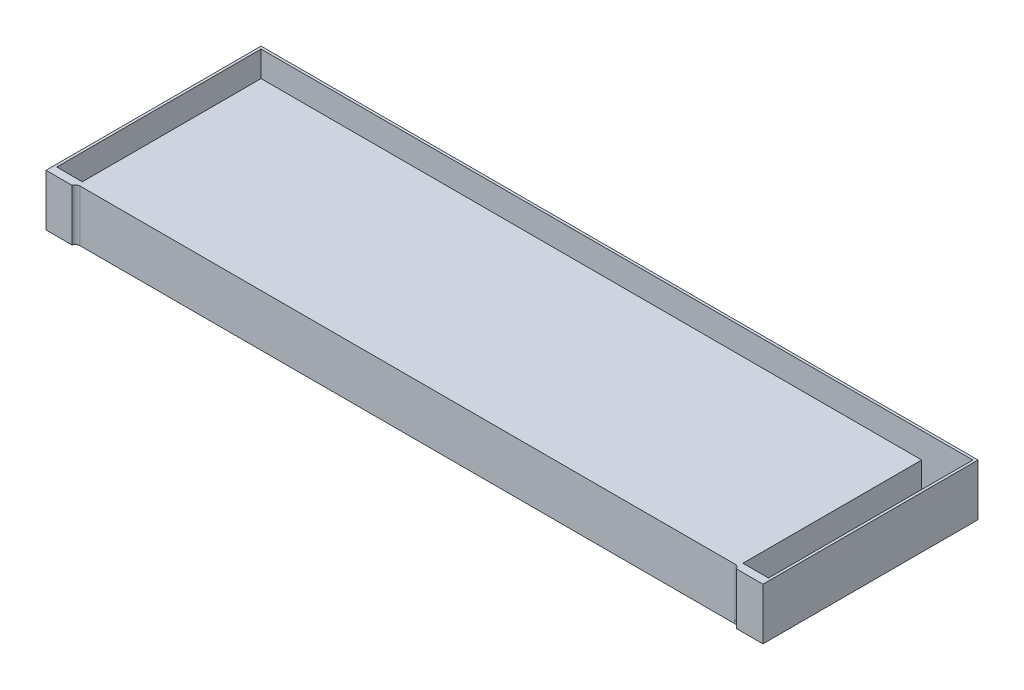
ISO-10303-21;
HEADER;
FILE_DESCRIPTION(('STEP AP214'),'2;1');
FILE_NAME('part.step','',(''),(''),'','','');
FILE_SCHEMA(('AUTOMOTIVE_DESIGN { 1 0 10303 214 1 1 1 1 }'));
ENDSEC;
DATA;
#1=APPLICATION_CONTEXT('core data for automotive mechanical design processes');
#2=APPLICATION_PROTOCOL_DEFINITION('international standard','automotive_design',2000,#1);
#3=PRODUCT_CONTEXT('',#1,'mechanical');
#4=PRODUCT('Part','Part','',(#3));
#5=PRODUCT_RELATED_PRODUCT_CATEGORY('part','',(#4));
#6=PRODUCT_DEFINITION_FORMATION('','',#4);
#7=PRODUCT_DEFINITION_CONTEXT('part definition',#1,'design');
#8=PRODUCT_DEFINITION('design','',#6,#7);
#9=PRODUCT_DEFINITION_SHAPE('','',#8);
#10=(LENGTH_UNIT() NAMED_UNIT(*) SI_UNIT(.MILLI.,.METRE.));
#11=(NAMED_UNIT(*) PLANE_ANGLE_UNIT() SI_UNIT($,.RADIAN.));
#12=(NAMED_UNIT(*) SI_UNIT($,.STERADIAN.) SOLID_ANGLE_UNIT());
#13=UNCERTAINTY_MEASURE_WITH_UNIT(LENGTH_MEASURE(1.E-05),#10,'distance_accuracy_value','');
#14=(GEOMETRIC_REPRESENTATION_CONTEXT(3) GLOBAL_UNCERTAINTY_ASSIGNED_CONTEXT((#13)) GLOBAL_UNIT_ASSIGNED_CONTEXT((#10,
#11,#12)) REPRESENTATION_CONTEXT('',''));
#15=CARTESIAN_POINT('',(0.,0.,0.));
#16=DIRECTION('',(0.,0.,1.));
#17=DIRECTION('',(1.,0.,0.));
#18=AXIS2_PLACEMENT_3D('',#15,#16,#17);
#19=CARTESIAN_POINT('',(170.399999999994,-68.1212867515913,-3.85));
#20=DIRECTION('',(1.,0.,0.));
#21=DIRECTION('',(0.,0.,-1.));
#22=AXIS2_PLACEMENT_3D('',#19,#20,#21);
#23=PLANE('',#22);
#24=DIRECTION('',(0.,0.,-1.));
#25=VECTOR('',#24,1.);
#26=CARTESIAN_POINT('',(170.399999999994,-66.101,-3.85));
#27=LINE('',#26,#25);
#28=CARTESIAN_POINT('',(170.399999999994,-66.101,3.13136582984871));
#29=VERTEX_POINT('',#28);
#30=CARTESIAN_POINT('',(170.399999999994,-66.101,-3.85));
#31=VERTEX_POINT('',#30);
#32=EDGE_CURVE('E322',#29,#31,#27,.T.);
#33=ORIENTED_EDGE('',*,*,#32,.F.);
#34=DIRECTION('',(0.,1.,0.));
#35=VECTOR('',#34,1.);
#36=CARTESIAN_POINT('',(170.399999999994,-68.1212867515913,3.13136582984871));
#37=LINE('',#36,#35);
#38=CARTESIAN_POINT('',(170.399999999994,-68.1212867515913,3.13136582984871));
#39=VERTEX_POINT('',#38);
#40=EDGE_CURVE('E37',#39,#29,#37,.T.);
#41=ORIENTED_EDGE('',*,*,#40,.F.);
#42=DIRECTION('',(0.,0.,-1.));
#43=VECTOR('',#42,1.);
#44=CARTESIAN_POINT('',(170.399999999994,-68.1212867515913,-3.85));
#45=LINE('',#44,#43);
#46=CARTESIAN_POINT('',(170.399999999994,-68.1212867515913,-3.85));
#47=VERTEX_POINT('',#46);
#48=EDGE_CURVE('E378',#39,#47,#45,.T.);
#49=ORIENTED_EDGE('',*,*,#48,.T.);
#50=DIRECTION('',(0.,1.,0.));
#51=VECTOR('',#50,1.);
#52=CARTESIAN_POINT('',(170.399999999994,-68.1212867515913,-3.85));
#53=LINE('',#52,#51);
#54=EDGE_CURVE('E10',#47,#31,#53,.T.);
#55=ORIENTED_EDGE('',*,*,#54,.T.);
#56=EDGE_LOOP('',(#33,#41,#49,#55));
#57=FACE_BOUND('',#56,.T.);
#58=ADVANCED_FACE('F16',(#57),#23,.T.);
#59=CARTESIAN_POINT('',(157.499999999994,-68.1212867515913,-3.85));
#60=DIRECTION('',(0.,0.,-1.));
#61=DIRECTION('',(-1.,0.,0.));
#62=AXIS2_PLACEMENT_3D('',#59,#60,#61);
#63=PLANE('',#62);
#64=DIRECTION('',(-1.,0.,0.));
#65=VECTOR('',#64,1.);
#66=CARTESIAN_POINT('',(157.499999999994,-66.101,-3.85));
#67=LINE('',#66,#65);
#68=CARTESIAN_POINT('',(144.599999999994,-66.101,-3.85));
#69=VERTEX_POINT('',#68);
#70=EDGE_CURVE('E326',#31,#69,#67,.T.);
#71=ORIENTED_EDGE('',*,*,#70,.F.);
#72=ORIENTED_EDGE('',*,*,#54,.F.);
#73=DIRECTION('',(-1.,0.,0.));
#74=VECTOR('',#73,1.);
#75=CARTESIAN_POINT('',(157.499999999994,-68.1212867515913,-3.85));
#76=LINE('',#75,#74);
#77=CARTESIAN_POINT('',(144.599999999994,-68.1212867515913,-3.85));
#78=VERTEX_POINT('',#77);
#79=EDGE_CURVE('E380',#47,#78,#76,.T.);
#80=ORIENTED_EDGE('',*,*,#79,.T.);
#81=DIRECTION('',(0.,1.,0.));
#82=VECTOR('',#81,1.);
#83=CARTESIAN_POINT('',(144.599999999994,-68.1212867515913,-3.85));
#84=LINE('',#83,#82);
#85=EDGE_CURVE('E28',#78,#69,#84,.T.);
#86=ORIENTED_EDGE('',*,*,#85,.T.);
#87=EDGE_LOOP('',(#71,#72,#80,#86));
#88=FACE_BOUND('',#87,.T.);
#89=ADVANCED_FACE('F313',(#88),#63,.T.);
#90=CARTESIAN_POINT('',(144.599999999994,-68.1212867515913,-3.84999999999999));
#91=DIRECTION('',(-1.,0.,0.));
#92=DIRECTION('',(0.,0.,1.));
#93=AXIS2_PLACEMENT_3D('',#90,#91,#92);
#94=PLANE('',#93);
#95=DIRECTION('',(0.,0.,1.));
#96=VECTOR('',#95,1.);
#97=CARTESIAN_POINT('',(144.599999999994,-66.101,-3.84999999999999));
#98=LINE('',#97,#96);
#99=CARTESIAN_POINT('',(144.599999999994,-66.101,3.13136582984872));
#100=VERTEX_POINT('',#99);
#101=EDGE_CURVE('E328',#69,#100,#98,.T.);
#102=ORIENTED_EDGE('',*,*,#101,.F.);
#103=ORIENTED_EDGE('',*,*,#85,.F.);
#104=DIRECTION('',(0.,0.,1.));
#105=VECTOR('',#104,1.);
#106=CARTESIAN_POINT('',(144.599999999994,-68.1212867515913,-3.84999999999999));
#107=LINE('',#106,#105);
#108=CARTESIAN_POINT('',(144.599999999994,-68.1212867515913,3.13136582984872));
#109=VERTEX_POINT('',#108);
#110=EDGE_CURVE('E383',#78,#109,#107,.T.);
#111=ORIENTED_EDGE('',*,*,#110,.T.);
#112=DIRECTION('',(0.,1.,0.));
#113=VECTOR('',#112,1.);
#114=CARTESIAN_POINT('',(144.599999999994,-68.1212867515913,3.13136582984872));
#115=LINE('',#114,#113);
#116=EDGE_CURVE('E243',#109,#100,#115,.T.);
#117=ORIENTED_EDGE('',*,*,#116,.T.);
#118=EDGE_LOOP('',(#102,#103,#111,#117));
#119=FACE_BOUND('',#118,.T.);
#120=ADVANCED_FACE('F309',(#119),#94,.T.);
#121=CARTESIAN_POINT('',(157.499999999994,-68.1212867515913,3.13136582984873));
#122=DIRECTION('',(0.,0.,1.));
#123=DIRECTION('',(1.,0.,0.));
#124=AXIS2_PLACEMENT_3D('',#121,#122,#123);
#125=PLANE('',#124);
#126=DIRECTION('',(1.,0.,0.));
#127=VECTOR('',#126,1.);
#128=CARTESIAN_POINT('',(157.499999999994,-66.101,3.13136582984873));
#129=LINE('',#128,#127);
#130=CARTESIAN_POINT('',(143.599999999994,-66.101,3.13136582984872));
#131=VERTEX_POINT('',#130);
#132=EDGE_CURVE('E336',#131,#100,#129,.T.);
#133=ORIENTED_EDGE('',*,*,#132,.T.);
#134=ORIENTED_EDGE('',*,*,#116,.F.);
#135=DIRECTION('',(1.,0.,0.));
#136=VECTOR('',#135,1.);
#137=CARTESIAN_POINT('',(157.499999999994,-68.1212867515913,3.13136582984873));
#138=LINE('',#137,#136);
#139=CARTESIAN_POINT('',(143.599999999994,-68.1212867515913,3.13136582984872));
#140=VERTEX_POINT('',#139);
#141=EDGE_CURVE('E386',#140,#109,#138,.T.);
#142=ORIENTED_EDGE('',*,*,#141,.F.);
#143=DIRECTION('',(0.,1.,0.));
#144=VECTOR('',#143,1.);
#145=CARTESIAN_POINT('',(143.599999999994,-68.1212867515913,3.13136582984872));
#146=LINE('',#145,#144);
#147=EDGE_CURVE('E241',#140,#131,#146,.T.);
#148=ORIENTED_EDGE('',*,*,#147,.T.);
#149=EDGE_LOOP('',(#133,#134,#142,#148));
#150=FACE_BOUND('',#149,.T.);
#151=ADVANCED_FACE('F305',(#150),#125,.F.);
#152=CARTESIAN_POINT('',(143.599999999994,-68.1212867515913,-3.84999999999999));
#153=DIRECTION('',(1.,0.,0.));
#154=DIRECTION('',(0.,0.,-1.));
#155=AXIS2_PLACEMENT_3D('',#152,#153,#154);
#156=PLANE('',#155);
#157=DIRECTION('',(0.,0.,-1.));
#158=VECTOR('',#157,1.);
#159=CARTESIAN_POINT('',(143.599999999994,-66.101,-3.84999999999999));
#160=LINE('',#159,#158);
#161=CARTESIAN_POINT('',(143.599999999994,-66.101,-4.85));
#162=VERTEX_POINT('',#161);
#163=EDGE_CURVE('E339',#131,#162,#160,.T.);
#164=ORIENTED_EDGE('',*,*,#163,.F.);
#165=ORIENTED_EDGE('',*,*,#147,.F.);
#166=DIRECTION('',(0.,0.,-1.));
#167=VECTOR('',#166,1.);
#168=CARTESIAN_POINT('',(143.599999999994,-68.1212867515913,-3.84999999999999));
#169=LINE('',#168,#167);
#170=CARTESIAN_POINT('',(143.599999999994,-68.1212867515913,-4.85));
#171=VERTEX_POINT('',#170);
#172=EDGE_CURVE('E158',#140,#171,#169,.T.);
#173=ORIENTED_EDGE('',*,*,#172,.T.);
#174=DIRECTION('',(0.,1.,0.));
#175=VECTOR('',#174,1.);
#176=CARTESIAN_POINT('',(143.599999999994,-68.1212867515913,-4.85));
#177=LINE('',#176,#175);
#178=EDGE_CURVE('E150',#171,#162,#177,.T.);
#179=ORIENTED_EDGE('',*,*,#178,.T.);
#180=EDGE_LOOP('',(#164,#165,#173,#179));
#181=FACE_BOUND('',#180,.T.);
#182=ADVANCED_FACE('F302',(#181),#156,.T.);
#183=CARTESIAN_POINT('',(157.499999999994,-68.1212867515913,-4.85));
#184=DIRECTION('',(0.,0.,1.));
#185=DIRECTION('',(1.,0.,0.));
#186=AXIS2_PLACEMENT_3D('',#183,#184,#185);
#187=PLANE('',#186);
#188=DIRECTION('',(1.,0.,0.));
#189=VECTOR('',#188,1.);
#190=CARTESIAN_POINT('',(157.499999999994,-66.101,-4.85));
#191=LINE('',#190,#189);
#192=CARTESIAN_POINT('',(171.399999999994,-66.101,-4.85));
#193=VERTEX_POINT('',#192);
#194=EDGE_CURVE('E342',#162,#193,#191,.T.);
#195=ORIENTED_EDGE('',*,*,#194,.F.);
#196=ORIENTED_EDGE('',*,*,#178,.F.);
#197=DIRECTION('',(1.,0.,0.));
#198=VECTOR('',#197,1.);
#199=CARTESIAN_POINT('',(157.499999999994,-68.1212867515913,-4.85));
#200=LINE('',#199,#198);
#201=CARTESIAN_POINT('',(171.399999999994,-68.1212867515913,-4.85));
#202=VERTEX_POINT('',#201);
#203=EDGE_CURVE('E153',#171,#202,#200,.T.);
#204=ORIENTED_EDGE('',*,*,#203,.T.);
#205=DIRECTION('',(0.,1.,0.));
#206=VECTOR('',#205,1.);
#207=CARTESIAN_POINT('',(171.399999999994,-68.1212867515913,-4.85));
#208=LINE('',#207,#206);
#209=EDGE_CURVE('E139',#202,#193,#208,.T.);
#210=ORIENTED_EDGE('',*,*,#209,.T.);
#211=EDGE_LOOP('',(#195,#196,#204,#210));
#212=FACE_BOUND('',#211,.T.);
#213=ADVANCED_FACE('F154',(#212),#187,.T.);
#214=CARTESIAN_POINT('',(171.399999999994,-68.1212867515913,-3.85));
#215=DIRECTION('',(-1.,0.,0.));
#216=DIRECTION('',(0.,0.,1.));
#217=AXIS2_PLACEMENT_3D('',#214,#215,#216);
#218=PLANE('',#217);
#219=DIRECTION('',(0.,0.,1.));
#220=VECTOR('',#219,1.);
#221=CARTESIAN_POINT('',(171.399999999994,-66.101,-3.85));
#222=LINE('',#221,#220);
#223=CARTESIAN_POINT('',(171.399999999994,-66.101,3.13136582984871));
#224=VERTEX_POINT('',#223);
#225=EDGE_CURVE('E146',#193,#224,#222,.T.);
#226=ORIENTED_EDGE('',*,*,#225,.F.);
#227=ORIENTED_EDGE('',*,*,#209,.F.);
#228=DIRECTION('',(0.,0.,1.));
#229=VECTOR('',#228,1.);
#230=CARTESIAN_POINT('',(171.399999999994,-68.1212867515913,-3.85));
#231=LINE('',#230,#229);
#232=CARTESIAN_POINT('',(171.399999999994,-68.1212867515913,3.13136582984871));
#233=VERTEX_POINT('',#232);
#234=EDGE_CURVE('E143',#202,#233,#231,.T.);
#235=ORIENTED_EDGE('',*,*,#234,.T.);
#236=DIRECTION('',(0.,1.,0.));
#237=VECTOR('',#236,1.);
#238=CARTESIAN_POINT('',(171.399999999994,-68.1212867515913,3.13136582984871));
#239=LINE('',#238,#237);
#240=EDGE_CURVE('E89',#233,#224,#239,.T.);
#241=ORIENTED_EDGE('',*,*,#240,.T.);
#242=EDGE_LOOP('',(#226,#227,#235,#241));
#243=FACE_BOUND('',#242,.T.);
#244=ADVANCED_FACE('F141',(#243),#218,.T.);
#245=CARTESIAN_POINT('',(157.499999999994,-68.1212867515913,3.3180937540411));
#246=DIRECTION('',(0.,0.,-1.));
#247=DIRECTION('',(-1.,0.,0.));
#248=AXIS2_PLACEMENT_3D('',#245,#246,#247);
#249=PLANE('',#248);
#250=DIRECTION('',(-1.,0.,0.));
#251=VECTOR('',#250,1.);
#252=CARTESIAN_POINT('',(157.499999999994,-66.101,3.3180937540411));
#253=LINE('',#252,#251);
#254=CARTESIAN_POINT('',(170.280474884227,-66.101,3.31809375404108));
#255=VERTEX_POINT('',#254);
#256=CARTESIAN_POINT('',(144.699999999995,-66.101,3.31809375404113));
#257=VERTEX_POINT('',#256);
#258=EDGE_CURVE('E283',#255,#257,#253,.T.);
#259=ORIENTED_EDGE('',*,*,#258,.T.);
#260=DIRECTION('',(0.,1.,0.));
#261=VECTOR('',#260,1.);
#262=CARTESIAN_POINT('',(144.699999999995,-68.1212867515913,3.31809375404113));
#263=LINE('',#262,#261);
#264=CARTESIAN_POINT('',(144.699999999995,-68.1212867515913,3.31809375404113));
#265=VERTEX_POINT('',#264);
#266=EDGE_CURVE('E164',#265,#257,#263,.T.);
#267=ORIENTED_EDGE('',*,*,#266,.F.);
#268=DIRECTION('',(-1.,0.,0.));
#269=VECTOR('',#268,1.);
#270=CARTESIAN_POINT('',(157.499999999994,-68.1212867515913,3.3180937540411));
#271=LINE('',#270,#269);
#272=CARTESIAN_POINT('',(170.280474884227,-68.1212867515913,3.31809375404108));
#273=VERTEX_POINT('',#272);
#274=EDGE_CURVE('E347',#273,#265,#271,.T.);
#275=ORIENTED_EDGE('',*,*,#274,.F.);
#276=CARTESIAN_POINT('',(170.280474884228,-66.101,3.31809375404165));
#277=DIRECTION('',(0.,-1.,0.));
#278=VECTOR('',#277,1.);
#279=LINE('',#276,#278);
#280=EDGE_CURVE('E100',#273,#255,#279,.F.);
#281=ORIENTED_EDGE('',*,*,#280,.T.);
#282=EDGE_LOOP('',(#259,#267,#275,#281));
#283=FACE_BOUND('',#282,.T.);
#284=ADVANCED_FACE('F18',(#283),#249,.F.);
#285=CARTESIAN_POINT('',(170.280474884228,-68.1212867515945,3.31809375404165));
#286=CARTESIAN_POINT('',(170.362858537335,-68.1212867515945,3.31813615782617));
#287=CARTESIAN_POINT('',(170.44058854765,-68.1212867515913,3.37282356809234));
#288=CARTESIAN_POINT('',(170.469179609123,-68.1212867515913,3.44999999999994));
#289=B_SPLINE_CURVE_WITH_KNOTS('',3,(#285,#286,#287,#288),.UNSPECIFIED.,.F.,.F.,(4,4),(0.,1.),.UNSPECIFIED.);
#290=DIRECTION('',(0.,1.,0.));
#291=VECTOR('',#290,1.);
#292=SURFACE_OF_LINEAR_EXTRUSION('',#289,#291);
#293=CARTESIAN_POINT('',(170.469179609123,-66.101,3.44999999999994));
#294=CARTESIAN_POINT('',(170.44058854765,-66.101,3.37282356809234));
#295=CARTESIAN_POINT('',(170.362858537335,-66.1010000000033,3.31813615782617));
#296=CARTESIAN_POINT('',(170.280474884228,-66.1010000000033,3.31809375404165));
#297=B_SPLINE_CURVE_WITH_KNOTS('',3,(#293,#294,#295,#296),.UNSPECIFIED.,.F.,.F.,(4,4),(0.,1.),.UNSPECIFIED.);
#298=CARTESIAN_POINT('',(170.469179609123,-66.101,3.44999999999994));
#299=VERTEX_POINT('',#298);
#300=EDGE_CURVE('E181',#255,#299,#297,.F.);
#301=ORIENTED_EDGE('',*,*,#300,.F.);
#302=ORIENTED_EDGE('',*,*,#280,.F.);
#303=CARTESIAN_POINT('',(170.280474884228,-68.1212867515913,3.31809375404165));
#304=CARTESIAN_POINT('',(170.362858537335,-68.1212867515913,3.31813615782617));
#305=CARTESIAN_POINT('',(170.44058854765,-68.1212867515881,3.37282356809234));
#306=CARTESIAN_POINT('',(170.469179609123,-68.1212867515881,3.44999999999994));
#307=B_SPLINE_CURVE_WITH_KNOTS('',3,(#303,#304,#305,#306),.UNSPECIFIED.,.F.,.F.,(4,4),(0.,1.),.UNSPECIFIED.);
#308=CARTESIAN_POINT('',(170.469179609123,-68.1212867515913,3.44999999999994));
#309=VERTEX_POINT('',#308);
#310=EDGE_CURVE('E257',#273,#309,#307,.T.);
#311=ORIENTED_EDGE('',*,*,#310,.T.);
#312=CARTESIAN_POINT('',(170.469179609123,-68.1212867515913,3.44999999999994));
#313=DIRECTION('',(0.,1.,0.));
#314=VECTOR('',#313,1.);
#315=LINE('',#312,#314);
#316=EDGE_CURVE('E188',#309,#299,#315,.T.);
#317=ORIENTED_EDGE('',*,*,#316,.T.);
#318=EDGE_LOOP('',(#301,#302,#311,#317));
#319=FACE_BOUND('',#318,.T.);
#320=ADVANCED_FACE('F220',(#319),#292,.T.);
#321=CARTESIAN_POINT('',(157.499999999994,-68.1212867515913,3.44999999999995));
#322=DIRECTION('',(0.,0.,1.));
#323=DIRECTION('',(1.,0.,0.));
#324=AXIS2_PLACEMENT_3D('',#321,#322,#323);
#325=PLANE('',#324);
#326=DIRECTION('',(1.,0.,0.));
#327=VECTOR('',#326,1.);
#328=CARTESIAN_POINT('',(157.499999999994,-66.101,3.44999999999995));
#329=LINE('',#328,#327);
#330=CARTESIAN_POINT('',(171.499999999994,-66.101,3.44999999999994));
#331=VERTEX_POINT('',#330);
#332=EDGE_CURVE('E177',#299,#331,#329,.T.);
#333=ORIENTED_EDGE('',*,*,#332,.F.);
#334=ORIENTED_EDGE('',*,*,#316,.F.);
#335=DIRECTION('',(1.,0.,0.));
#336=VECTOR('',#335,1.);
#337=CARTESIAN_POINT('',(157.499999999994,-68.1212867515913,3.44999999999995));
#338=LINE('',#337,#336);
#339=CARTESIAN_POINT('',(171.499999999994,-68.1212867515913,3.44999999999994));
#340=VERTEX_POINT('',#339);
#341=EDGE_CURVE('E232',#309,#340,#338,.T.);
#342=ORIENTED_EDGE('',*,*,#341,.T.);
#343=DIRECTION('',(0.,1.,0.));
#344=VECTOR('',#343,1.);
#345=CARTESIAN_POINT('',(171.499999999994,-68.1212867515913,3.44999999999994));
#346=LINE('',#345,#344);
#347=EDGE_CURVE('E255',#340,#331,#346,.T.);
#348=ORIENTED_EDGE('',*,*,#347,.T.);
#349=EDGE_LOOP('',(#333,#334,#342,#348));
#350=FACE_BOUND('',#349,.T.);
#351=ADVANCED_FACE('F207',(#350),#325,.T.);
#352=CARTESIAN_POINT('',(171.499999999994,-68.1212867515913,-3.85000000000001));
#353=DIRECTION('',(1.,0.,0.));
#354=DIRECTION('',(0.,0.,-1.));
#355=AXIS2_PLACEMENT_3D('',#352,#353,#354);
#356=PLANE('',#355);
#357=DIRECTION('',(0.,0.,-1.));
#358=VECTOR('',#357,1.);
#359=CARTESIAN_POINT('',(171.499999999994,-66.101,-3.85000000000001));
#360=LINE('',#359,#358);
#361=CARTESIAN_POINT('',(171.499999999994,-66.101,-4.95000000000006));
#362=VERTEX_POINT('',#361);
#363=EDGE_CURVE('E174',#331,#362,#360,.T.);
#364=ORIENTED_EDGE('',*,*,#363,.F.);
#365=ORIENTED_EDGE('',*,*,#347,.F.);
#366=DIRECTION('',(0.,0.,-1.));
#367=VECTOR('',#366,1.);
#368=CARTESIAN_POINT('',(171.499999999994,-68.1212867515913,-3.85000000000001));
#369=LINE('',#368,#367);
#370=CARTESIAN_POINT('',(171.499999999994,-68.1212867515913,-4.95000000000006));
#371=VERTEX_POINT('',#370);
#372=EDGE_CURVE('E362',#340,#371,#369,.T.);
#373=ORIENTED_EDGE('',*,*,#372,.T.);
#374=DIRECTION('',(0.,1.,0.));
#375=VECTOR('',#374,1.);
#376=CARTESIAN_POINT('',(171.499999999994,-68.1212867515913,-4.95000000000006));
#377=LINE('',#376,#375);
#378=EDGE_CURVE('E253',#371,#362,#377,.T.);
#379=ORIENTED_EDGE('',*,*,#378,.T.);
#380=EDGE_LOOP('',(#364,#365,#373,#379));
#381=FACE_BOUND('',#380,.T.);
#382=ADVANCED_FACE('F216',(#381),#356,.T.);
#383=CARTESIAN_POINT('',(157.499999999994,-68.1212867515913,-4.95000000000005));
#384=DIRECTION('',(0.,0.,-1.));
#385=DIRECTION('',(-1.,0.,0.));
#386=AXIS2_PLACEMENT_3D('',#383,#384,#385);
#387=PLANE('',#386);
#388=DIRECTION('',(-1.,0.,0.));
#389=VECTOR('',#388,1.);
#390=CARTESIAN_POINT('',(157.499999999994,-66.101,-4.95000000000005));
#391=LINE('',#390,#389);
#392=CARTESIAN_POINT('',(143.499999999994,-66.101,-4.95000000000004));
#393=VERTEX_POINT('',#392);
#394=EDGE_CURVE('E403',#362,#393,#391,.T.);
#395=ORIENTED_EDGE('',*,*,#394,.F.);
#396=ORIENTED_EDGE('',*,*,#378,.F.);
#397=DIRECTION('',(-1.,0.,0.));
#398=VECTOR('',#397,1.);
#399=CARTESIAN_POINT('',(157.499999999994,-68.1212867515913,-4.95000000000005));
#400=LINE('',#399,#398);
#401=CARTESIAN_POINT('',(143.499999999994,-68.1212867515913,-4.95000000000004));
#402=VERTEX_POINT('',#401);
#403=EDGE_CURVE('E365',#371,#402,#400,.T.);
#404=ORIENTED_EDGE('',*,*,#403,.T.);
#405=DIRECTION('',(0.,1.,0.));
#406=VECTOR('',#405,1.);
#407=CARTESIAN_POINT('',(143.499999999994,-68.1212867515913,-4.95000000000004));
#408=LINE('',#407,#406);
#409=EDGE_CURVE('E251',#402,#393,#408,.T.);
#410=ORIENTED_EDGE('',*,*,#409,.T.);
#411=EDGE_LOOP('',(#395,#396,#404,#410));
#412=FACE_BOUND('',#411,.T.);
#413=ADVANCED_FACE('F212',(#412),#387,.T.);
#414=CARTESIAN_POINT('',(143.499999999994,-68.1212867515913,-3.84999999999999));
#415=DIRECTION('',(-1.,0.,0.));
#416=DIRECTION('',(0.,0.,1.));
#417=AXIS2_PLACEMENT_3D('',#414,#415,#416);
#418=PLANE('',#417);
#419=DIRECTION('',(0.,0.,1.));
#420=VECTOR('',#419,1.);
#421=CARTESIAN_POINT('',(143.499999999994,-66.101,-3.84999999999999));
#422=LINE('',#421,#420);
#423=CARTESIAN_POINT('',(143.499999999994,-66.101,3.44999999999996));
#424=VERTEX_POINT('',#423);
#425=EDGE_CURVE('E173',#393,#424,#422,.T.);
#426=ORIENTED_EDGE('',*,*,#425,.F.);
#427=ORIENTED_EDGE('',*,*,#409,.F.);
#428=DIRECTION('',(0.,0.,1.));
#429=VECTOR('',#428,1.);
#430=CARTESIAN_POINT('',(143.499999999994,-68.1212867515913,-3.84999999999999));
#431=LINE('',#430,#429);
#432=CARTESIAN_POINT('',(143.499999999994,-68.1212867515913,3.44999999999996));
#433=VERTEX_POINT('',#432);
#434=EDGE_CURVE('E369',#402,#433,#431,.T.);
#435=ORIENTED_EDGE('',*,*,#434,.T.);
#436=DIRECTION('',(0.,1.,0.));
#437=VECTOR('',#436,1.);
#438=CARTESIAN_POINT('',(143.499999999994,-68.1212867515913,3.44999999999996));
#439=LINE('',#438,#437);
#440=EDGE_CURVE('E249',#433,#424,#439,.T.);
#441=ORIENTED_EDGE('',*,*,#440,.T.);
#442=EDGE_LOOP('',(#426,#427,#435,#441));
#443=FACE_BOUND('',#442,.T.);
#444=ADVANCED_FACE('F205',(#443),#418,.T.);
#445=CARTESIAN_POINT('',(144.512131348179,-66.101,3.44999999999996));
#446=VERTEX_POINT('',#445);
#447=EDGE_CURVE('E168',#424,#446,#329,.T.);
#448=ORIENTED_EDGE('',*,*,#447,.F.);
#449=ORIENTED_EDGE('',*,*,#440,.F.);
#450=CARTESIAN_POINT('',(144.512131348179,-68.1212867515913,3.44999999999996));
#451=VERTEX_POINT('',#450);
#452=EDGE_CURVE('E371',#433,#451,#338,.T.);
#453=ORIENTED_EDGE('',*,*,#452,.T.);
#454=DIRECTION('',(0.,1.,0.));
#455=VECTOR('',#454,1.);
#456=CARTESIAN_POINT('',(144.512131348179,-68.1212867515913,3.44999999999996));
#457=LINE('',#456,#455);
#458=EDGE_CURVE('E247',#451,#446,#457,.T.);
#459=ORIENTED_EDGE('',*,*,#458,.T.);
#460=EDGE_LOOP('',(#448,#449,#453,#459));
#461=FACE_BOUND('',#460,.T.);
#462=ADVANCED_FACE('F194',(#461),#325,.T.);
#463=CARTESIAN_POINT('',(144.699999999995,-68.1212867515913,3.5188577215498));
#464=DIRECTION('',(0.,1.,0.));
#465=DIRECTION('',(-1.92783029768601E-12,0.,-1.));
#466=AXIS2_PLACEMENT_3D('',#463,#464,#465);
#467=ELLIPSE('',#466,0.200763967508669,0.2);
#468=DIRECTION('',(0.,1.,0.));
#469=VECTOR('',#468,1.);
#470=SURFACE_OF_LINEAR_EXTRUSION('',#467,#469);
#471=CARTESIAN_POINT('',(144.699999999995,-66.101,3.5188577215498));
#472=DIRECTION('',(0.,1.,0.));
#473=DIRECTION('',(-1.92783029768601E-12,0.,-1.));
#474=AXIS2_PLACEMENT_3D('',#471,#472,#473);
#475=ELLIPSE('',#474,0.200763967508669,0.2);
#476=EDGE_CURVE('E172',#257,#446,#475,.T.);
#477=ORIENTED_EDGE('',*,*,#476,.T.);
#478=ORIENTED_EDGE('',*,*,#458,.F.);
#479=EDGE_CURVE('E375',#265,#451,#467,.T.);
#480=ORIENTED_EDGE('',*,*,#479,.F.);
#481=ORIENTED_EDGE('',*,*,#266,.T.);
#482=EDGE_LOOP('',(#477,#478,#480,#481));
#483=FACE_BOUND('',#482,.T.);
#484=ADVANCED_FACE('F204',(#483),#470,.F.);
#485=CARTESIAN_POINT('',(157.499999999994,-68.1212867515913,3.13136582984871));
#486=DIRECTION('',(0.,0.,1.));
#487=DIRECTION('',(1.,0.,0.));
#488=AXIS2_PLACEMENT_3D('',#485,#486,#487);
#489=PLANE('',#488);
#490=DIRECTION('',(1.,0.,0.));
#491=VECTOR('',#490,1.);
#492=CARTESIAN_POINT('',(157.499999999994,-66.101,3.13136582984871));
#493=LINE('',#492,#491);
#494=EDGE_CURVE('E345',#29,#224,#493,.T.);
#495=ORIENTED_EDGE('',*,*,#494,.T.);
#496=ORIENTED_EDGE('',*,*,#240,.F.);
#497=DIRECTION('',(1.,0.,0.));
#498=VECTOR('',#497,1.);
#499=CARTESIAN_POINT('',(157.499999999994,-68.1212867515913,3.13136582984871));
#500=LINE('',#499,#498);
#501=EDGE_CURVE('E162',#39,#233,#500,.T.);
#502=ORIENTED_EDGE('',*,*,#501,.F.);
#503=ORIENTED_EDGE('',*,*,#40,.T.);
#504=EDGE_LOOP('',(#495,#496,#502,#503));
#505=FACE_BOUND('',#504,.T.);
#506=ADVANCED_FACE('F295',(#505),#489,.F.);
#507=CARTESIAN_POINT('',(157.499999999994,-68.1212867515913,-3.85));
#508=DIRECTION('',(0.,1.,0.));
#509=DIRECTION('',(-1.,0.,0.));
#510=AXIS2_PLACEMENT_3D('',#507,#508,#509);
#511=PLANE('',#510);
#512=ORIENTED_EDGE('',*,*,#274,.T.);
#513=ORIENTED_EDGE('',*,*,#479,.T.);
#514=ORIENTED_EDGE('',*,*,#452,.F.);
#515=ORIENTED_EDGE('',*,*,#434,.F.);
#516=ORIENTED_EDGE('',*,*,#403,.F.);
#517=ORIENTED_EDGE('',*,*,#372,.F.);
#518=ORIENTED_EDGE('',*,*,#341,.F.);
#519=ORIENTED_EDGE('',*,*,#310,.F.);
#520=EDGE_LOOP('',(#512,#513,#514,#515,#516,#517,#518,#519));
#521=FACE_BOUND('',#520,.T.);
#522=ORIENTED_EDGE('',*,*,#48,.F.);
#523=ORIENTED_EDGE('',*,*,#501,.T.);
#524=ORIENTED_EDGE('',*,*,#234,.F.);
#525=ORIENTED_EDGE('',*,*,#203,.F.);
#526=ORIENTED_EDGE('',*,*,#172,.F.);
#527=ORIENTED_EDGE('',*,*,#141,.T.);
#528=ORIENTED_EDGE('',*,*,#110,.F.);
#529=ORIENTED_EDGE('',*,*,#79,.F.);
#530=EDGE_LOOP('',(#522,#523,#524,#525,#526,#527,#528,#529));
#531=FACE_BOUND('',#530,.T.);
#532=ADVANCED_FACE('F161',(#521,#531),#511,.F.);
#533=CARTESIAN_POINT('',(157.499999999994,-66.101,-3.85));
#534=DIRECTION('',(0.,1.,0.));
#535=DIRECTION('',(-1.,0.,0.));
#536=AXIS2_PLACEMENT_3D('',#533,#534,#535);
#537=PLANE('',#536);
#538=ORIENTED_EDGE('',*,*,#258,.F.);
#539=ORIENTED_EDGE('',*,*,#300,.T.);
#540=ORIENTED_EDGE('',*,*,#332,.T.);
#541=ORIENTED_EDGE('',*,*,#363,.T.);
#542=ORIENTED_EDGE('',*,*,#394,.T.);
#543=ORIENTED_EDGE('',*,*,#425,.T.);
#544=ORIENTED_EDGE('',*,*,#447,.T.);
#545=ORIENTED_EDGE('',*,*,#476,.F.);
#546=EDGE_LOOP('',(#538,#539,#540,#541,#542,#543,#544,#545));
#547=FACE_BOUND('',#546,.T.);
#548=ORIENTED_EDGE('',*,*,#32,.T.);
#549=ORIENTED_EDGE('',*,*,#70,.T.);
#550=ORIENTED_EDGE('',*,*,#101,.T.);
#551=ORIENTED_EDGE('',*,*,#132,.F.);
#552=ORIENTED_EDGE('',*,*,#163,.T.);
#553=ORIENTED_EDGE('',*,*,#194,.T.);
#554=ORIENTED_EDGE('',*,*,#225,.T.);
#555=ORIENTED_EDGE('',*,*,#494,.F.);
#556=EDGE_LOOP('',(#548,#549,#550,#551,#552,#553,#554,#555));
#557=FACE_BOUND('',#556,.T.);
#558=ADVANCED_FACE('F284',(#547,#557),#537,.T.);
#559=CLOSED_SHELL('',(#58,#89,#120,#151,#182,#213,#244,#284,#320,#351,#382,#413,#444,#462,#484,
#506,#532,#558));
#560=MANIFOLD_SOLID_BREP('B1',#559);
#561=ADVANCED_BREP_SHAPE_REPRESENTATION('',(#18,#560),#14);
#562=SHAPE_DEFINITION_REPRESENTATION(#9,#561);
ENDSEC;
END-ISO-10303-21;
